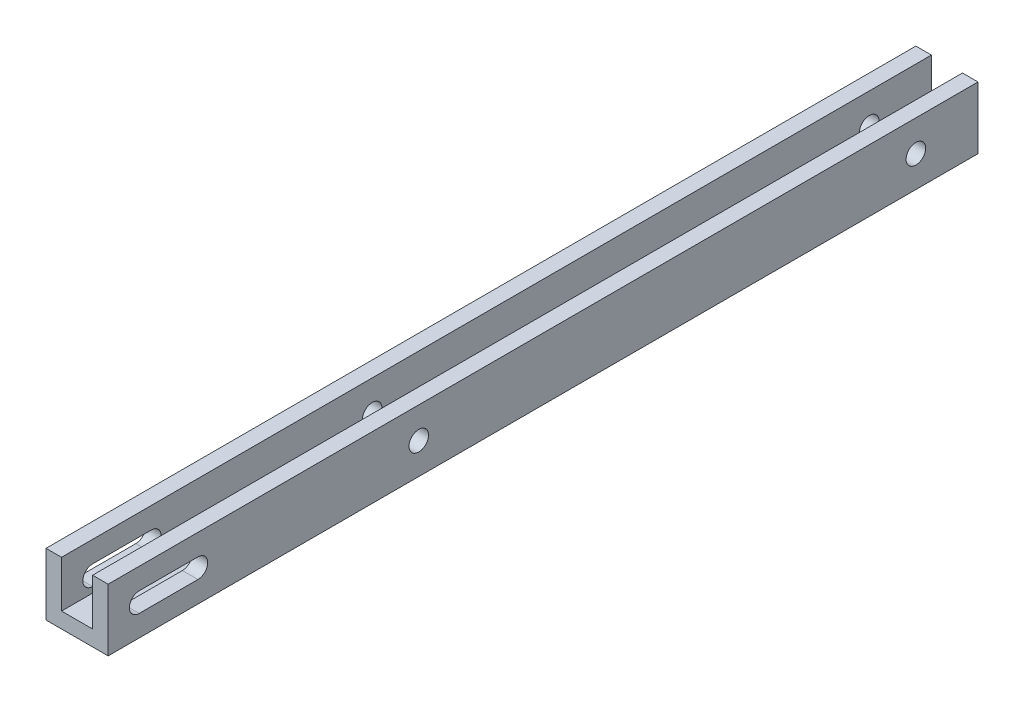
ISO-10303-21;
HEADER;
FILE_DESCRIPTION(('STEP AP214'),'2;1');
FILE_NAME('part.step','',(''),(''),'','','');
FILE_SCHEMA(('AUTOMOTIVE_DESIGN { 1 0 10303 214 1 1 1 1 }'));
ENDSEC;
DATA;
#1=APPLICATION_CONTEXT('core data for automotive mechanical design processes');
#2=APPLICATION_PROTOCOL_DEFINITION('international standard','automotive_design',2000,#1);
#3=PRODUCT_CONTEXT('',#1,'mechanical');
#4=PRODUCT('Part','Part','',(#3));
#5=PRODUCT_RELATED_PRODUCT_CATEGORY('part','',(#4));
#6=PRODUCT_DEFINITION_FORMATION('','',#4);
#7=PRODUCT_DEFINITION_CONTEXT('part definition',#1,'design');
#8=PRODUCT_DEFINITION('design','',#6,#7);
#9=PRODUCT_DEFINITION_SHAPE('','',#8);
#10=(LENGTH_UNIT() NAMED_UNIT(*) SI_UNIT(.MILLI.,.METRE.));
#11=(NAMED_UNIT(*) PLANE_ANGLE_UNIT() SI_UNIT($,.RADIAN.));
#12=(NAMED_UNIT(*) SI_UNIT($,.STERADIAN.) SOLID_ANGLE_UNIT());
#13=UNCERTAINTY_MEASURE_WITH_UNIT(LENGTH_MEASURE(1.E-05),#10,'distance_accuracy_value','');
#14=(GEOMETRIC_REPRESENTATION_CONTEXT(3) GLOBAL_UNCERTAINTY_ASSIGNED_CONTEXT((#13)) GLOBAL_UNIT_ASSIGNED_CONTEXT((#10,
#11,#12)) REPRESENTATION_CONTEXT('',''));
#15=CARTESIAN_POINT('',(0.,0.,0.));
#16=DIRECTION('',(0.,0.,1.));
#17=DIRECTION('',(1.,0.,0.));
#18=AXIS2_PLACEMENT_3D('',#15,#16,#17);
#19=CARTESIAN_POINT('',(-6.35,6.35,88.9));
#20=DIRECTION('',(0.,-1.,0.));
#21=DIRECTION('',(0.,0.,-1.));
#22=AXIS2_PLACEMENT_3D('',#19,#20,#21);
#23=PLANE('',#22);
#24=DIRECTION('',(-1.,0.,0.));
#25=VECTOR('',#24,1.);
#26=CARTESIAN_POINT('',(-6.35,6.35,-88.9));
#27=LINE('',#26,#25);
#28=CARTESIAN_POINT('',(-3.175,6.35,-88.9));
#29=VERTEX_POINT('',#28);
#30=CARTESIAN_POINT('',(-6.35,6.35,-88.9));
#31=VERTEX_POINT('',#30);
#32=EDGE_CURVE('E219',#29,#31,#27,.T.);
#33=ORIENTED_EDGE('',*,*,#32,.T.);
#34=DIRECTION('',(0.,0.,-1.));
#35=VECTOR('',#34,1.);
#36=CARTESIAN_POINT('',(-6.35,6.35,88.9));
#37=LINE('',#36,#35);
#38=CARTESIAN_POINT('',(-6.35,6.35,88.9));
#39=VERTEX_POINT('',#38);
#40=EDGE_CURVE('E270',#39,#31,#37,.T.);
#41=ORIENTED_EDGE('',*,*,#40,.F.);
#42=DIRECTION('',(-1.,0.,0.));
#43=VECTOR('',#42,1.);
#44=CARTESIAN_POINT('',(-6.35,6.35,88.9));
#45=LINE('',#44,#43);
#46=CARTESIAN_POINT('',(-3.175,6.35,88.9));
#47=VERTEX_POINT('',#46);
#48=EDGE_CURVE('E192',#47,#39,#45,.T.);
#49=ORIENTED_EDGE('',*,*,#48,.F.);
#50=DIRECTION('',(0.,0.,-1.));
#51=VECTOR('',#50,1.);
#52=CARTESIAN_POINT('',(-3.175,6.35,88.9));
#53=LINE('',#52,#51);
#54=EDGE_CURVE('E218',#47,#29,#53,.T.);
#55=ORIENTED_EDGE('',*,*,#54,.T.);
#56=EDGE_LOOP('',(#33,#41,#49,#55));
#57=FACE_BOUND('',#56,.T.);
#58=ADVANCED_FACE('F39',(#57),#23,.F.);
#59=CARTESIAN_POINT('',(-6.35,6.35,88.9));
#60=DIRECTION('',(1.,0.,0.));
#61=DIRECTION('',(0.,1.,0.));
#62=AXIS2_PLACEMENT_3D('',#59,#60,#61);
#63=PLANE('',#62);
#64=DIRECTION('',(0.,0.,1.));
#65=VECTOR('',#64,1.);
#66=CARTESIAN_POINT('',(-6.35,2.,82.55));
#67=LINE('',#66,#65);
#68=CARTESIAN_POINT('',(-6.35,2.,70.55));
#69=VERTEX_POINT('',#68);
#70=CARTESIAN_POINT('',(-6.35,2.,82.55));
#71=VERTEX_POINT('',#70);
#72=EDGE_CURVE('E317',#69,#71,#67,.T.);
#73=ORIENTED_EDGE('',*,*,#72,.T.);
#74=CARTESIAN_POINT('',(-6.35,0.,82.55));
#75=DIRECTION('',(1.,0.,0.));
#76=DIRECTION('',(0.,1.,0.));
#77=AXIS2_PLACEMENT_3D('',#74,#75,#76);
#78=CIRCLE('',#77,2.);
#79=CARTESIAN_POINT('',(-6.35,-2.,82.55));
#80=VERTEX_POINT('',#79);
#81=EDGE_CURVE('E571',#71,#80,#78,.T.);
#82=ORIENTED_EDGE('',*,*,#81,.T.);
#83=DIRECTION('',(0.,0.,-1.));
#84=VECTOR('',#83,1.);
#85=CARTESIAN_POINT('',(-6.35,-2.,82.55));
#86=LINE('',#85,#84);
#87=CARTESIAN_POINT('',(-6.35,-2.,70.55));
#88=VERTEX_POINT('',#87);
#89=EDGE_CURVE('E575',#80,#88,#86,.T.);
#90=ORIENTED_EDGE('',*,*,#89,.T.);
#91=CARTESIAN_POINT('',(-6.35,0.,70.55));
#92=DIRECTION('',(1.,0.,0.));
#93=DIRECTION('',(0.,1.,0.));
#94=AXIS2_PLACEMENT_3D('',#91,#92,#93);
#95=CIRCLE('',#94,2.);
#96=EDGE_CURVE('E57',#88,#69,#95,.T.);
#97=ORIENTED_EDGE('',*,*,#96,.T.);
#98=EDGE_LOOP('',(#73,#82,#90,#97));
#99=FACE_BOUND('',#98,.T.);
#100=CARTESIAN_POINT('',(-6.35,0.,-76.2));
#101=DIRECTION('',(1.,0.,0.));
#102=DIRECTION('',(0.,1.,0.));
#103=AXIS2_PLACEMENT_3D('',#100,#101,#102);
#104=CIRCLE('',#103,2.);
#105=CARTESIAN_POINT('',(-6.35,1.99999999999999,-76.2));
#106=VERTEX_POINT('',#105);
#107=EDGE_CURVE('E323',#106,#106,#104,.T.);
#108=ORIENTED_EDGE('',*,*,#107,.T.);
#109=EDGE_LOOP('',(#108));
#110=FACE_BOUND('',#109,.T.);
#111=CARTESIAN_POINT('',(-6.35,0.,25.4));
#112=DIRECTION('',(1.,0.,0.));
#113=DIRECTION('',(0.,1.,0.));
#114=AXIS2_PLACEMENT_3D('',#111,#112,#113);
#115=CIRCLE('',#114,2.);
#116=CARTESIAN_POINT('',(-6.35,2.,25.4));
#117=VERTEX_POINT('',#116);
#118=EDGE_CURVE('E280',#117,#117,#115,.T.);
#119=ORIENTED_EDGE('',*,*,#118,.T.);
#120=EDGE_LOOP('',(#119));
#121=FACE_BOUND('',#120,.T.);
#122=DIRECTION('',(0.,-1.,0.));
#123=VECTOR('',#122,1.);
#124=CARTESIAN_POINT('',(-6.35,6.35,-88.9));
#125=LINE('',#124,#123);
#126=CARTESIAN_POINT('',(-6.35,-6.35,-88.9));
#127=VERTEX_POINT('',#126);
#128=EDGE_CURVE('E223',#31,#127,#125,.T.);
#129=ORIENTED_EDGE('',*,*,#128,.T.);
#130=DIRECTION('',(0.,0.,-1.));
#131=VECTOR('',#130,1.);
#132=CARTESIAN_POINT('',(-6.35,-6.35,88.9));
#133=LINE('',#132,#131);
#134=CARTESIAN_POINT('',(-6.35,-6.35,88.9));
#135=VERTEX_POINT('',#134);
#136=EDGE_CURVE('E266',#135,#127,#133,.T.);
#137=ORIENTED_EDGE('',*,*,#136,.F.);
#138=DIRECTION('',(0.,-1.,0.));
#139=VECTOR('',#138,1.);
#140=CARTESIAN_POINT('',(-6.35,6.35,88.9));
#141=LINE('',#140,#139);
#142=EDGE_CURVE('E196',#39,#135,#141,.T.);
#143=ORIENTED_EDGE('',*,*,#142,.F.);
#144=ORIENTED_EDGE('',*,*,#40,.T.);
#145=EDGE_LOOP('',(#129,#137,#143,#144));
#146=FACE_BOUND('',#145,.T.);
#147=ADVANCED_FACE('F384',(#99,#110,#121,#146),#63,.F.);
#148=CARTESIAN_POINT('',(-6.35,-6.35,88.9));
#149=DIRECTION('',(0.,1.,0.));
#150=DIRECTION('',(-1.,0.,0.));
#151=AXIS2_PLACEMENT_3D('',#148,#149,#150);
#152=PLANE('',#151);
#153=DIRECTION('',(1.,0.,0.));
#154=VECTOR('',#153,1.);
#155=CARTESIAN_POINT('',(-6.35,-6.35,-88.9));
#156=LINE('',#155,#154);
#157=CARTESIAN_POINT('',(6.35,-6.35,-88.9));
#158=VERTEX_POINT('',#157);
#159=EDGE_CURVE('E226',#127,#158,#156,.T.);
#160=ORIENTED_EDGE('',*,*,#159,.T.);
#161=DIRECTION('',(0.,0.,-1.));
#162=VECTOR('',#161,1.);
#163=CARTESIAN_POINT('',(6.35,-6.35,88.9));
#164=LINE('',#163,#162);
#165=CARTESIAN_POINT('',(6.35,-6.35,88.9));
#166=VERTEX_POINT('',#165);
#167=EDGE_CURVE('E262',#166,#158,#164,.T.);
#168=ORIENTED_EDGE('',*,*,#167,.F.);
#169=DIRECTION('',(1.,0.,0.));
#170=VECTOR('',#169,1.);
#171=CARTESIAN_POINT('',(-6.35,-6.35,88.9));
#172=LINE('',#171,#170);
#173=EDGE_CURVE('E200',#135,#166,#172,.T.);
#174=ORIENTED_EDGE('',*,*,#173,.F.);
#175=ORIENTED_EDGE('',*,*,#136,.T.);
#176=EDGE_LOOP('',(#160,#168,#174,#175));
#177=FACE_BOUND('',#176,.T.);
#178=ADVANCED_FACE('F349',(#177),#152,.F.);
#179=CARTESIAN_POINT('',(6.35,-6.35,88.9));
#180=DIRECTION('',(-1.,0.,0.));
#181=DIRECTION('',(0.,-1.,0.));
#182=AXIS2_PLACEMENT_3D('',#179,#180,#181);
#183=PLANE('',#182);
#184=DIRECTION('',(0.,0.,1.));
#185=VECTOR('',#184,1.);
#186=CARTESIAN_POINT('',(6.35,-2.,82.55));
#187=LINE('',#186,#185);
#188=CARTESIAN_POINT('',(6.35,-2.,82.55));
#189=VERTEX_POINT('',#188);
#190=CARTESIAN_POINT('',(6.34999999999999,-2.,70.55));
#191=VERTEX_POINT('',#190);
#192=EDGE_CURVE('E158',#189,#191,#187,.F.);
#193=ORIENTED_EDGE('',*,*,#192,.F.);
#194=CARTESIAN_POINT('',(6.34999999999999,0.,82.55));
#195=DIRECTION('',(1.,0.,0.));
#196=DIRECTION('',(0.,1.,0.));
#197=AXIS2_PLACEMENT_3D('',#194,#195,#196);
#198=CIRCLE('',#197,2.);
#199=CARTESIAN_POINT('',(6.34999999999999,2.,82.55));
#200=VERTEX_POINT('',#199);
#201=EDGE_CURVE('E42',#200,#189,#198,.T.);
#202=ORIENTED_EDGE('',*,*,#201,.F.);
#203=DIRECTION('',(0.,0.,1.));
#204=VECTOR('',#203,1.);
#205=CARTESIAN_POINT('',(6.35,2.,82.55));
#206=LINE('',#205,#204);
#207=CARTESIAN_POINT('',(6.34999999999999,2.,70.55));
#208=VERTEX_POINT('',#207);
#209=EDGE_CURVE('E81',#208,#200,#206,.T.);
#210=ORIENTED_EDGE('',*,*,#209,.F.);
#211=CARTESIAN_POINT('',(6.34999999999999,0.,70.55));
#212=DIRECTION('',(1.,0.,0.));
#213=DIRECTION('',(0.,1.,0.));
#214=AXIS2_PLACEMENT_3D('',#211,#212,#213);
#215=CIRCLE('',#214,2.);
#216=EDGE_CURVE('E172',#191,#208,#215,.T.);
#217=ORIENTED_EDGE('',*,*,#216,.F.);
#218=EDGE_LOOP('',(#193,#202,#210,#217));
#219=FACE_BOUND('',#218,.T.);
#220=CARTESIAN_POINT('',(6.35,0.,-76.2));
#221=DIRECTION('',(-1.,0.,0.));
#222=DIRECTION('',(0.,-1.,0.));
#223=AXIS2_PLACEMENT_3D('',#220,#221,#222);
#224=CIRCLE('',#223,2.);
#225=CARTESIAN_POINT('',(6.35,2.,-76.2));
#226=VERTEX_POINT('',#225);
#227=EDGE_CURVE('E177',#226,#226,#224,.T.);
#228=ORIENTED_EDGE('',*,*,#227,.T.);
#229=EDGE_LOOP('',(#228));
#230=FACE_BOUND('',#229,.T.);
#231=CARTESIAN_POINT('',(6.35,0.,25.4));
#232=DIRECTION('',(-1.,0.,0.));
#233=DIRECTION('',(0.,-1.,0.));
#234=AXIS2_PLACEMENT_3D('',#231,#232,#233);
#235=CIRCLE('',#234,2.);
#236=CARTESIAN_POINT('',(6.35,2.,25.4));
#237=VERTEX_POINT('',#236);
#238=EDGE_CURVE('E285',#237,#237,#235,.T.);
#239=ORIENTED_EDGE('',*,*,#238,.T.);
#240=EDGE_LOOP('',(#239));
#241=FACE_BOUND('',#240,.T.);
#242=DIRECTION('',(0.,1.,0.));
#243=VECTOR('',#242,1.);
#244=CARTESIAN_POINT('',(6.35,-6.35,-88.9));
#245=LINE('',#244,#243);
#246=CARTESIAN_POINT('',(6.34999999999999,6.35,-88.9));
#247=VERTEX_POINT('',#246);
#248=EDGE_CURVE('E229',#158,#247,#245,.T.);
#249=ORIENTED_EDGE('',*,*,#248,.T.);
#250=DIRECTION('',(0.,0.,-1.));
#251=VECTOR('',#250,1.);
#252=CARTESIAN_POINT('',(6.34999999999999,6.35,88.9));
#253=LINE('',#252,#251);
#254=CARTESIAN_POINT('',(6.34999999999999,6.35,88.9));
#255=VERTEX_POINT('',#254);
#256=EDGE_CURVE('E258',#255,#247,#253,.T.);
#257=ORIENTED_EDGE('',*,*,#256,.F.);
#258=DIRECTION('',(0.,1.,0.));
#259=VECTOR('',#258,1.);
#260=CARTESIAN_POINT('',(6.35,-6.35,88.9));
#261=LINE('',#260,#259);
#262=EDGE_CURVE('E203',#166,#255,#261,.T.);
#263=ORIENTED_EDGE('',*,*,#262,.F.);
#264=ORIENTED_EDGE('',*,*,#167,.T.);
#265=EDGE_LOOP('',(#249,#257,#263,#264));
#266=FACE_BOUND('',#265,.T.);
#267=ADVANCED_FACE('F305',(#219,#230,#241,#266),#183,.F.);
#268=CARTESIAN_POINT('',(3.175,6.35,88.9));
#269=DIRECTION('',(0.,-1.,0.));
#270=DIRECTION('',(1.,0.,0.));
#271=AXIS2_PLACEMENT_3D('',#268,#269,#270);
#272=PLANE('',#271);
#273=DIRECTION('',(-1.,0.,0.));
#274=VECTOR('',#273,1.);
#275=CARTESIAN_POINT('',(3.175,6.35,-88.9));
#276=LINE('',#275,#274);
#277=CARTESIAN_POINT('',(3.175,6.35,-88.9));
#278=VERTEX_POINT('',#277);
#279=EDGE_CURVE('E232',#247,#278,#276,.T.);
#280=ORIENTED_EDGE('',*,*,#279,.T.);
#281=DIRECTION('',(0.,0.,-1.));
#282=VECTOR('',#281,1.);
#283=CARTESIAN_POINT('',(3.175,6.35,88.9));
#284=LINE('',#283,#282);
#285=CARTESIAN_POINT('',(3.175,6.35,88.9));
#286=VERTEX_POINT('',#285);
#287=EDGE_CURVE('E254',#286,#278,#284,.T.);
#288=ORIENTED_EDGE('',*,*,#287,.F.);
#289=DIRECTION('',(-1.,0.,0.));
#290=VECTOR('',#289,1.);
#291=CARTESIAN_POINT('',(3.175,6.35,88.9));
#292=LINE('',#291,#290);
#293=EDGE_CURVE('E206',#255,#286,#292,.T.);
#294=ORIENTED_EDGE('',*,*,#293,.F.);
#295=ORIENTED_EDGE('',*,*,#256,.T.);
#296=EDGE_LOOP('',(#280,#288,#294,#295));
#297=FACE_BOUND('',#296,.T.);
#298=ADVANCED_FACE('F348',(#297),#272,.F.);
#299=CARTESIAN_POINT('',(3.175,-3.175,88.9));
#300=DIRECTION('',(1.,0.,0.));
#301=DIRECTION('',(0.,1.,0.));
#302=AXIS2_PLACEMENT_3D('',#299,#300,#301);
#303=PLANE('',#302);
#304=DIRECTION('',(0.,0.,1.));
#305=VECTOR('',#304,1.);
#306=CARTESIAN_POINT('',(3.175,2.,88.9));
#307=LINE('',#306,#305);
#308=CARTESIAN_POINT('',(3.17499999999999,2.,70.55));
#309=VERTEX_POINT('',#308);
#310=CARTESIAN_POINT('',(3.175,2.,82.55));
#311=VERTEX_POINT('',#310);
#312=EDGE_CURVE('E187',#309,#311,#307,.T.);
#313=ORIENTED_EDGE('',*,*,#312,.T.);
#314=CARTESIAN_POINT('',(3.175,0.,82.55));
#315=DIRECTION('',(1.,0.,0.));
#316=DIRECTION('',(0.,1.,0.));
#317=AXIS2_PLACEMENT_3D('',#314,#315,#316);
#318=CIRCLE('',#317,2.);
#319=CARTESIAN_POINT('',(3.175,-2.,82.55));
#320=VERTEX_POINT('',#319);
#321=EDGE_CURVE('E91',#311,#320,#318,.T.);
#322=ORIENTED_EDGE('',*,*,#321,.T.);
#323=DIRECTION('',(0.,0.,-1.));
#324=VECTOR('',#323,1.);
#325=CARTESIAN_POINT('',(3.175,-2.,88.9));
#326=LINE('',#325,#324);
#327=CARTESIAN_POINT('',(3.175,-2.,70.55));
#328=VERTEX_POINT('',#327);
#329=EDGE_CURVE('E156',#320,#328,#326,.T.);
#330=ORIENTED_EDGE('',*,*,#329,.T.);
#331=CARTESIAN_POINT('',(3.175,0.,70.55));
#332=DIRECTION('',(1.,0.,0.));
#333=DIRECTION('',(0.,1.,0.));
#334=AXIS2_PLACEMENT_3D('',#331,#332,#333);
#335=CIRCLE('',#334,2.);
#336=EDGE_CURVE('E166',#328,#309,#335,.T.);
#337=ORIENTED_EDGE('',*,*,#336,.T.);
#338=EDGE_LOOP('',(#313,#322,#330,#337));
#339=FACE_BOUND('',#338,.T.);
#340=CARTESIAN_POINT('',(3.175,0.,-76.2));
#341=DIRECTION('',(1.,0.,0.));
#342=DIRECTION('',(0.,1.,0.));
#343=AXIS2_PLACEMENT_3D('',#340,#341,#342);
#344=CIRCLE('',#343,2.);
#345=CARTESIAN_POINT('',(3.175,2.,-76.2));
#346=VERTEX_POINT('',#345);
#347=EDGE_CURVE('E183',#346,#346,#344,.T.);
#348=ORIENTED_EDGE('',*,*,#347,.T.);
#349=EDGE_LOOP('',(#348));
#350=FACE_BOUND('',#349,.T.);
#351=CARTESIAN_POINT('',(3.175,0.,25.4));
#352=DIRECTION('',(1.,0.,0.));
#353=DIRECTION('',(0.,1.,0.));
#354=AXIS2_PLACEMENT_3D('',#351,#352,#353);
#355=CIRCLE('',#354,2.);
#356=CARTESIAN_POINT('',(3.175,2.,25.4));
#357=VERTEX_POINT('',#356);
#358=EDGE_CURVE('E279',#357,#357,#355,.T.);
#359=ORIENTED_EDGE('',*,*,#358,.T.);
#360=EDGE_LOOP('',(#359));
#361=FACE_BOUND('',#360,.T.);
#362=DIRECTION('',(0.,-1.,0.));
#363=VECTOR('',#362,1.);
#364=CARTESIAN_POINT('',(3.175,-3.175,-88.9));
#365=LINE('',#364,#363);
#366=CARTESIAN_POINT('',(3.175,-3.175,-88.9));
#367=VERTEX_POINT('',#366);
#368=EDGE_CURVE('E235',#278,#367,#365,.T.);
#369=ORIENTED_EDGE('',*,*,#368,.T.);
#370=DIRECTION('',(0.,0.,-1.));
#371=VECTOR('',#370,1.);
#372=CARTESIAN_POINT('',(3.175,-3.175,88.9));
#373=LINE('',#372,#371);
#374=CARTESIAN_POINT('',(3.175,-3.175,88.9));
#375=VERTEX_POINT('',#374);
#376=EDGE_CURVE('E250',#375,#367,#373,.T.);
#377=ORIENTED_EDGE('',*,*,#376,.F.);
#378=DIRECTION('',(0.,-1.,0.));
#379=VECTOR('',#378,1.);
#380=CARTESIAN_POINT('',(3.175,-3.175,88.9));
#381=LINE('',#380,#379);
#382=EDGE_CURVE('E209',#286,#375,#381,.T.);
#383=ORIENTED_EDGE('',*,*,#382,.F.);
#384=ORIENTED_EDGE('',*,*,#287,.T.);
#385=EDGE_LOOP('',(#369,#377,#383,#384));
#386=FACE_BOUND('',#385,.T.);
#387=ADVANCED_FACE('F174',(#339,#350,#361,#386),#303,.F.);
#388=CARTESIAN_POINT('',(-3.175,-3.175,88.9));
#389=DIRECTION('',(0.,-1.,0.));
#390=DIRECTION('',(1.,0.,0.));
#391=AXIS2_PLACEMENT_3D('',#388,#389,#390);
#392=PLANE('',#391);
#393=DIRECTION('',(-1.,0.,0.));
#394=VECTOR('',#393,1.);
#395=CARTESIAN_POINT('',(-3.175,-3.175,-88.9));
#396=LINE('',#395,#394);
#397=CARTESIAN_POINT('',(-3.175,-3.175,-88.9));
#398=VERTEX_POINT('',#397);
#399=EDGE_CURVE('E238',#367,#398,#396,.T.);
#400=ORIENTED_EDGE('',*,*,#399,.T.);
#401=DIRECTION('',(0.,0.,-1.));
#402=VECTOR('',#401,1.);
#403=CARTESIAN_POINT('',(-3.175,-3.175,88.9));
#404=LINE('',#403,#402);
#405=CARTESIAN_POINT('',(-3.175,-3.175,88.9));
#406=VERTEX_POINT('',#405);
#407=EDGE_CURVE('E246',#406,#398,#404,.T.);
#408=ORIENTED_EDGE('',*,*,#407,.F.);
#409=DIRECTION('',(-1.,0.,0.));
#410=VECTOR('',#409,1.);
#411=CARTESIAN_POINT('',(-3.175,-3.175,88.9));
#412=LINE('',#411,#410);
#413=EDGE_CURVE('E212',#375,#406,#412,.T.);
#414=ORIENTED_EDGE('',*,*,#413,.F.);
#415=ORIENTED_EDGE('',*,*,#376,.T.);
#416=EDGE_LOOP('',(#400,#408,#414,#415));
#417=FACE_BOUND('',#416,.T.);
#418=ADVANCED_FACE('F373',(#417),#392,.F.);
#419=CARTESIAN_POINT('',(-3.175,6.35,88.9));
#420=DIRECTION('',(-1.,0.,0.));
#421=DIRECTION('',(0.,0.,1.));
#422=AXIS2_PLACEMENT_3D('',#419,#420,#421);
#423=PLANE('',#422);
#424=DIRECTION('',(0.,0.,1.));
#425=VECTOR('',#424,1.);
#426=CARTESIAN_POINT('',(-3.175,-2.,88.9));
#427=LINE('',#426,#425);
#428=CARTESIAN_POINT('',(-3.175,-2.,70.55));
#429=VERTEX_POINT('',#428);
#430=CARTESIAN_POINT('',(-3.175,-2.,82.55));
#431=VERTEX_POINT('',#430);
#432=EDGE_CURVE('E274',#429,#431,#427,.T.);
#433=ORIENTED_EDGE('',*,*,#432,.T.);
#434=CARTESIAN_POINT('',(-3.175,0.,82.55));
#435=DIRECTION('',(-1.,0.,0.));
#436=DIRECTION('',(0.,0.,1.));
#437=AXIS2_PLACEMENT_3D('',#434,#435,#436);
#438=CIRCLE('',#437,2.);
#439=CARTESIAN_POINT('',(-3.175,2.,82.55));
#440=VERTEX_POINT('',#439);
#441=EDGE_CURVE('E11',#431,#440,#438,.T.);
#442=ORIENTED_EDGE('',*,*,#441,.T.);
#443=DIRECTION('',(0.,0.,-1.));
#444=VECTOR('',#443,1.);
#445=CARTESIAN_POINT('',(-3.175,2.,88.9));
#446=LINE('',#445,#444);
#447=CARTESIAN_POINT('',(-3.175,2.,70.55));
#448=VERTEX_POINT('',#447);
#449=EDGE_CURVE('E49',#440,#448,#446,.T.);
#450=ORIENTED_EDGE('',*,*,#449,.T.);
#451=CARTESIAN_POINT('',(-3.175,0.,70.55));
#452=DIRECTION('',(-1.,0.,0.));
#453=DIRECTION('',(0.,0.,1.));
#454=AXIS2_PLACEMENT_3D('',#451,#452,#453);
#455=CIRCLE('',#454,2.);
#456=EDGE_CURVE('E289',#448,#429,#455,.T.);
#457=ORIENTED_EDGE('',*,*,#456,.T.);
#458=EDGE_LOOP('',(#433,#442,#450,#457));
#459=FACE_BOUND('',#458,.T.);
#460=CARTESIAN_POINT('',(-3.175,0.,-76.2));
#461=DIRECTION('',(-1.,0.,0.));
#462=DIRECTION('',(0.,0.,1.));
#463=AXIS2_PLACEMENT_3D('',#460,#461,#462);
#464=CIRCLE('',#463,2.);
#465=CARTESIAN_POINT('',(-3.175,2.,-76.2));
#466=VERTEX_POINT('',#465);
#467=EDGE_CURVE('E281',#466,#466,#464,.T.);
#468=ORIENTED_EDGE('',*,*,#467,.T.);
#469=EDGE_LOOP('',(#468));
#470=FACE_BOUND('',#469,.T.);
#471=CARTESIAN_POINT('',(-3.175,0.,25.4));
#472=DIRECTION('',(-1.,0.,0.));
#473=DIRECTION('',(0.,0.,1.));
#474=AXIS2_PLACEMENT_3D('',#471,#472,#473);
#475=CIRCLE('',#474,2.);
#476=CARTESIAN_POINT('',(-3.175,2.,25.4));
#477=VERTEX_POINT('',#476);
#478=EDGE_CURVE('E275',#477,#477,#475,.T.);
#479=ORIENTED_EDGE('',*,*,#478,.T.);
#480=EDGE_LOOP('',(#479));
#481=FACE_BOUND('',#480,.T.);
#482=DIRECTION('',(0.,1.,0.));
#483=VECTOR('',#482,1.);
#484=CARTESIAN_POINT('',(-3.175,6.35,-88.9));
#485=LINE('',#484,#483);
#486=EDGE_CURVE('E197',#398,#29,#485,.T.);
#487=ORIENTED_EDGE('',*,*,#486,.T.);
#488=ORIENTED_EDGE('',*,*,#54,.F.);
#489=DIRECTION('',(0.,1.,0.));
#490=VECTOR('',#489,1.);
#491=CARTESIAN_POINT('',(-3.175,6.35,88.9));
#492=LINE('',#491,#490);
#493=EDGE_CURVE('E215',#406,#47,#492,.T.);
#494=ORIENTED_EDGE('',*,*,#493,.F.);
#495=ORIENTED_EDGE('',*,*,#407,.T.);
#496=EDGE_LOOP('',(#487,#488,#494,#495));
#497=FACE_BOUND('',#496,.T.);
#498=ADVANCED_FACE('F388',(#459,#470,#481,#497),#423,.F.);
#499=CARTESIAN_POINT('',(-3.175,6.35,88.9));
#500=DIRECTION('',(0.,0.,-1.));
#501=DIRECTION('',(-1.,0.,0.));
#502=AXIS2_PLACEMENT_3D('',#499,#500,#501);
#503=PLANE('',#502);
#504=ORIENTED_EDGE('',*,*,#48,.T.);
#505=ORIENTED_EDGE('',*,*,#142,.T.);
#506=ORIENTED_EDGE('',*,*,#173,.T.);
#507=ORIENTED_EDGE('',*,*,#262,.T.);
#508=ORIENTED_EDGE('',*,*,#293,.T.);
#509=ORIENTED_EDGE('',*,*,#382,.T.);
#510=ORIENTED_EDGE('',*,*,#413,.T.);
#511=ORIENTED_EDGE('',*,*,#493,.T.);
#512=EDGE_LOOP('',(#504,#505,#506,#507,#508,#509,#510,#511));
#513=FACE_BOUND('',#512,.T.);
#514=ADVANCED_FACE('F377',(#513),#503,.F.);
#515=CARTESIAN_POINT('',(-3.175,6.35,-88.9));
#516=DIRECTION('',(0.,0.,-1.));
#517=DIRECTION('',(-1.,0.,0.));
#518=AXIS2_PLACEMENT_3D('',#515,#516,#517);
#519=PLANE('',#518);
#520=ORIENTED_EDGE('',*,*,#32,.F.);
#521=ORIENTED_EDGE('',*,*,#486,.F.);
#522=ORIENTED_EDGE('',*,*,#399,.F.);
#523=ORIENTED_EDGE('',*,*,#368,.F.);
#524=ORIENTED_EDGE('',*,*,#279,.F.);
#525=ORIENTED_EDGE('',*,*,#248,.F.);
#526=ORIENTED_EDGE('',*,*,#159,.F.);
#527=ORIENTED_EDGE('',*,*,#128,.F.);
#528=EDGE_LOOP('',(#520,#521,#522,#523,#524,#525,#526,#527));
#529=FACE_BOUND('',#528,.T.);
#530=ADVANCED_FACE('F365',(#529),#519,.T.);
#531=CARTESIAN_POINT('',(-6.35,0.,25.4));
#532=DIRECTION('',(1.,0.,0.));
#533=DIRECTION('',(0.,1.,0.));
#534=AXIS2_PLACEMENT_3D('',#531,#532,#533);
#535=CYLINDRICAL_SURFACE('',#534,2.);
#536=CARTESIAN_POINT('',(-6.35,2.,25.4));
#537=CARTESIAN_POINT('',(-6.31692708333333,2.,25.4));
#538=CARTESIAN_POINT('',(-6.28385416666667,2.,25.4));
#539=CARTESIAN_POINT('',(-6.21770833333333,2.,25.4));
#540=CARTESIAN_POINT('',(-6.18463541666666,2.,25.4));
#541=CARTESIAN_POINT('',(-6.11848958333333,2.,25.4));
#542=CARTESIAN_POINT('',(-6.08541666666667,2.,25.4));
#543=CARTESIAN_POINT('',(-6.01927083333333,2.,25.4));
#544=CARTESIAN_POINT('',(-5.98619791666667,2.,25.4));
#545=CARTESIAN_POINT('',(-5.92005208333333,2.,25.4));
#546=CARTESIAN_POINT('',(-5.88697916666667,2.,25.4));
#547=CARTESIAN_POINT('',(-5.82083333333333,2.,25.4));
#548=CARTESIAN_POINT('',(-5.78776041666667,2.,25.4));
#549=CARTESIAN_POINT('',(-5.72161458333333,2.,25.4));
#550=CARTESIAN_POINT('',(-5.68854166666667,2.,25.4));
#551=CARTESIAN_POINT('',(-5.62239583333333,2.,25.4));
#552=CARTESIAN_POINT('',(-5.58932291666667,2.,25.4));
#553=CARTESIAN_POINT('',(-5.52317708333333,2.,25.4));
#554=CARTESIAN_POINT('',(-5.49010416666667,2.,25.4));
#555=CARTESIAN_POINT('',(-5.42395833333333,2.,25.4));
#556=CARTESIAN_POINT('',(-5.39088541666667,2.,25.4));
#557=CARTESIAN_POINT('',(-5.32473958333333,2.,25.4));
#558=CARTESIAN_POINT('',(-5.29166666666667,2.,25.4));
#559=CARTESIAN_POINT('',(-5.22552083333333,2.,25.4));
#560=CARTESIAN_POINT('',(-5.19244791666667,2.,25.4));
#561=CARTESIAN_POINT('',(-5.12630208333333,2.,25.4));
#562=CARTESIAN_POINT('',(-5.09322916666667,2.,25.4));
#563=CARTESIAN_POINT('',(-5.02708333333333,2.,25.4));
#564=CARTESIAN_POINT('',(-4.99401041666667,2.,25.4));
#565=CARTESIAN_POINT('',(-4.92786458333333,2.,25.4));
#566=CARTESIAN_POINT('',(-4.89479166666667,2.,25.4));
#567=CARTESIAN_POINT('',(-4.82864583333333,2.,25.4));
#568=CARTESIAN_POINT('',(-4.79557291666667,2.,25.4));
#569=CARTESIAN_POINT('',(-4.72942708333333,2.,25.4));
#570=CARTESIAN_POINT('',(-4.69635416666667,2.,25.4));
#571=CARTESIAN_POINT('',(-4.63020833333333,2.,25.4));
#572=CARTESIAN_POINT('',(-4.59713541666667,2.,25.4));
#573=CARTESIAN_POINT('',(-4.53098958333333,2.,25.4));
#574=CARTESIAN_POINT('',(-4.49791666666667,2.,25.4));
#575=CARTESIAN_POINT('',(-4.43177083333333,2.,25.4));
#576=CARTESIAN_POINT('',(-4.39869791666667,2.,25.4));
#577=CARTESIAN_POINT('',(-4.33255208333333,2.,25.4));
#578=CARTESIAN_POINT('',(-4.29947916666667,2.,25.4));
#579=CARTESIAN_POINT('',(-4.23333333333333,2.,25.4));
#580=CARTESIAN_POINT('',(-4.20026041666667,2.,25.4));
#581=CARTESIAN_POINT('',(-4.13411458333333,2.,25.4));
#582=CARTESIAN_POINT('',(-4.10104166666667,2.,25.4));
#583=CARTESIAN_POINT('',(-4.03489583333333,2.,25.4));
#584=CARTESIAN_POINT('',(-4.00182291666667,2.,25.4));
#585=CARTESIAN_POINT('',(-3.93567708333333,2.,25.4));
#586=CARTESIAN_POINT('',(-3.90260416666667,2.,25.4));
#587=CARTESIAN_POINT('',(-3.83645833333333,2.,25.4));
#588=CARTESIAN_POINT('',(-3.80338541666667,2.,25.4));
#589=CARTESIAN_POINT('',(-3.73723958333333,2.,25.4));
#590=CARTESIAN_POINT('',(-3.70416666666667,2.,25.4));
#591=CARTESIAN_POINT('',(-3.63802083333333,2.,25.4));
#592=CARTESIAN_POINT('',(-3.60494791666667,2.,25.4));
#593=CARTESIAN_POINT('',(-3.53880208333333,2.,25.4));
#594=CARTESIAN_POINT('',(-3.50572916666667,2.,25.4));
#595=CARTESIAN_POINT('',(-3.43958333333333,2.,25.4));
#596=CARTESIAN_POINT('',(-3.40651041666667,2.,25.4));
#597=CARTESIAN_POINT('',(-3.34036458333333,2.,25.4));
#598=CARTESIAN_POINT('',(-3.30729166666667,2.,25.4));
#599=CARTESIAN_POINT('',(-3.24114583333333,2.,25.4));
#600=CARTESIAN_POINT('',(-3.20807291666667,2.,25.4));
#601=CARTESIAN_POINT('',(-3.175,2.,25.4));
#602=B_SPLINE_CURVE_WITH_KNOTS('',3,(#536,#537,#538,#539,#540,#541,#542,#543,#544,#545,#546,
#547,#548,#549,#550,#551,#552,#553,#554,#555,#556,#557,#558,#559,#560,#561,#562,#563,#564,#565,
#566,#567,#568,#569,#570,#571,#572,#573,#574,#575,#576,#577,#578,#579,#580,#581,#582,#583,#584,
#585,#586,#587,#588,#589,#590,#591,#592,#593,#594,#595,#596,#597,#598,#599,#600,#601),
.UNSPECIFIED.,.F.,.F.,(4,2,2,2,2,2,2,2,2,2,2,2,2,2,2,2,2,2,2,2,2,2,2,2,2,2,2,2,2,2,2,2,4),(0.,
0.0992187500000004,0.198437500000001,0.29765625,0.396875000000001,0.49609375,0.5953125,
0.69453125,0.79375,0.89296875,0.9921875,1.09140625,1.190625,1.28984375,1.3890625,1.48828125,
1.5875,1.68671875,1.7859375,1.88515625,1.984375,2.08359375,2.1828125,2.28203125,2.38125,
2.48046875,2.5796875,2.67890625,2.778125,2.87734375,2.9765625,3.07578125,3.175),.UNSPECIFIED.);
#603=EDGE_CURVE('BSEAM442',#117,#477,#602,.T.);
#604=ORIENTED_EDGE('',*,*,#118,.F.);
#605=ORIENTED_EDGE('',*,*,#478,.F.);
#606=ORIENTED_EDGE('',*,*,#603,.T.);
#607=ORIENTED_EDGE('',*,*,#603,.F.);
#608=EDGE_LOOP('',(#604,#606,#605,#607));
#609=FACE_BOUND('',#608,.T.);
#610=ADVANCED_FACE('F442',(#609),#535,.F.);
#611=CARTESIAN_POINT('',(-6.35,0.,-76.2));
#612=DIRECTION('',(1.,0.,0.));
#613=DIRECTION('',(0.,1.,0.));
#614=AXIS2_PLACEMENT_3D('',#611,#612,#613);
#615=CYLINDRICAL_SURFACE('',#614,2.);
#616=CARTESIAN_POINT('',(-6.35,1.99999999999999,-76.2));
#617=CARTESIAN_POINT('',(-6.31692708333333,1.99999999999999,-76.2));
#618=CARTESIAN_POINT('',(-6.28385416666667,1.99999999999999,-76.2));
#619=CARTESIAN_POINT('',(-6.21770833333333,1.99999999999999,-76.2));
#620=CARTESIAN_POINT('',(-6.18463541666666,1.99999999999999,-76.2));
#621=CARTESIAN_POINT('',(-6.11848958333333,1.99999999999999,-76.2));
#622=CARTESIAN_POINT('',(-6.08541666666667,1.99999999999999,-76.2));
#623=CARTESIAN_POINT('',(-6.01927083333333,1.99999999999999,-76.2));
#624=CARTESIAN_POINT('',(-5.98619791666667,1.99999999999999,-76.2));
#625=CARTESIAN_POINT('',(-5.92005208333333,1.99999999999999,-76.2));
#626=CARTESIAN_POINT('',(-5.88697916666667,1.99999999999999,-76.2));
#627=CARTESIAN_POINT('',(-5.82083333333333,1.99999999999999,-76.2));
#628=CARTESIAN_POINT('',(-5.78776041666667,1.99999999999999,-76.2));
#629=CARTESIAN_POINT('',(-5.72161458333333,1.99999999999999,-76.2));
#630=CARTESIAN_POINT('',(-5.68854166666667,1.99999999999999,-76.2));
#631=CARTESIAN_POINT('',(-5.62239583333333,1.99999999999999,-76.2));
#632=CARTESIAN_POINT('',(-5.58932291666667,1.99999999999999,-76.2));
#633=CARTESIAN_POINT('',(-5.52317708333333,1.99999999999999,-76.2));
#634=CARTESIAN_POINT('',(-5.49010416666667,1.99999999999999,-76.2));
#635=CARTESIAN_POINT('',(-5.42395833333333,1.99999999999999,-76.2));
#636=CARTESIAN_POINT('',(-5.39088541666667,1.99999999999999,-76.2));
#637=CARTESIAN_POINT('',(-5.32473958333333,1.99999999999999,-76.2));
#638=CARTESIAN_POINT('',(-5.29166666666667,1.99999999999999,-76.2));
#639=CARTESIAN_POINT('',(-5.22552083333333,1.99999999999999,-76.2));
#640=CARTESIAN_POINT('',(-5.19244791666667,1.99999999999999,-76.2));
#641=CARTESIAN_POINT('',(-5.12630208333333,1.99999999999999,-76.2));
#642=CARTESIAN_POINT('',(-5.09322916666667,1.99999999999999,-76.2));
#643=CARTESIAN_POINT('',(-5.02708333333333,1.99999999999999,-76.2));
#644=CARTESIAN_POINT('',(-4.99401041666667,1.99999999999999,-76.2));
#645=CARTESIAN_POINT('',(-4.92786458333333,1.99999999999999,-76.2));
#646=CARTESIAN_POINT('',(-4.89479166666667,1.99999999999999,-76.2));
#647=CARTESIAN_POINT('',(-4.82864583333333,1.99999999999999,-76.2));
#648=CARTESIAN_POINT('',(-4.79557291666667,1.99999999999999,-76.2));
#649=CARTESIAN_POINT('',(-4.72942708333333,1.99999999999999,-76.2));
#650=CARTESIAN_POINT('',(-4.69635416666667,1.99999999999999,-76.2));
#651=CARTESIAN_POINT('',(-4.63020833333333,1.99999999999999,-76.2));
#652=CARTESIAN_POINT('',(-4.59713541666667,1.99999999999999,-76.2));
#653=CARTESIAN_POINT('',(-4.53098958333333,1.99999999999999,-76.2));
#654=CARTESIAN_POINT('',(-4.49791666666667,1.99999999999999,-76.2));
#655=CARTESIAN_POINT('',(-4.43177083333333,1.99999999999999,-76.2));
#656=CARTESIAN_POINT('',(-4.39869791666667,1.99999999999999,-76.2));
#657=CARTESIAN_POINT('',(-4.33255208333333,1.99999999999999,-76.2));
#658=CARTESIAN_POINT('',(-4.29947916666667,1.99999999999999,-76.2));
#659=CARTESIAN_POINT('',(-4.23333333333333,1.99999999999999,-76.2));
#660=CARTESIAN_POINT('',(-4.20026041666667,1.99999999999999,-76.2));
#661=CARTESIAN_POINT('',(-4.13411458333333,1.99999999999999,-76.2));
#662=CARTESIAN_POINT('',(-4.10104166666667,1.99999999999999,-76.2));
#663=CARTESIAN_POINT('',(-4.03489583333333,1.99999999999999,-76.2));
#664=CARTESIAN_POINT('',(-4.00182291666667,1.99999999999999,-76.2));
#665=CARTESIAN_POINT('',(-3.93567708333333,1.99999999999999,-76.2));
#666=CARTESIAN_POINT('',(-3.90260416666667,2.,-76.2));
#667=CARTESIAN_POINT('',(-3.83645833333333,2.,-76.2));
#668=CARTESIAN_POINT('',(-3.80338541666667,2.,-76.2));
#669=CARTESIAN_POINT('',(-3.73723958333333,2.,-76.2));
#670=CARTESIAN_POINT('',(-3.70416666666667,2.,-76.2));
#671=CARTESIAN_POINT('',(-3.63802083333333,2.,-76.2));
#672=CARTESIAN_POINT('',(-3.60494791666667,2.,-76.2));
#673=CARTESIAN_POINT('',(-3.53880208333333,2.,-76.2));
#674=CARTESIAN_POINT('',(-3.50572916666667,2.,-76.2));
#675=CARTESIAN_POINT('',(-3.43958333333333,2.,-76.2));
#676=CARTESIAN_POINT('',(-3.40651041666667,2.,-76.2));
#677=CARTESIAN_POINT('',(-3.34036458333333,2.,-76.2));
#678=CARTESIAN_POINT('',(-3.30729166666667,2.,-76.2));
#679=CARTESIAN_POINT('',(-3.24114583333333,2.,-76.2));
#680=CARTESIAN_POINT('',(-3.20807291666667,2.,-76.2));
#681=CARTESIAN_POINT('',(-3.175,2.,-76.2));
#682=B_SPLINE_CURVE_WITH_KNOTS('',3,(#616,#617,#618,#619,#620,#621,#622,#623,#624,#625,#626,
#627,#628,#629,#630,#631,#632,#633,#634,#635,#636,#637,#638,#639,#640,#641,#642,#643,#644,#645,
#646,#647,#648,#649,#650,#651,#652,#653,#654,#655,#656,#657,#658,#659,#660,#661,#662,#663,#664,
#665,#666,#667,#668,#669,#670,#671,#672,#673,#674,#675,#676,#677,#678,#679,#680,#681),
.UNSPECIFIED.,.F.,.F.,(4,2,2,2,2,2,2,2,2,2,2,2,2,2,2,2,2,2,2,2,2,2,2,2,2,2,2,2,2,2,2,2,4),(0.,
0.0992187500000004,0.198437500000001,0.29765625,0.396875000000001,0.49609375,0.5953125,
0.69453125,0.79375,0.89296875,0.9921875,1.09140625,1.190625,1.28984375,1.3890625,1.48828125,
1.5875,1.68671875,1.7859375,1.88515625,1.984375,2.08359375,2.1828125,2.28203125,2.38125,
2.48046875,2.5796875,2.67890625,2.778125,2.87734375,2.9765625,3.07578125,3.175),.UNSPECIFIED.);
#683=EDGE_CURVE('BSEAM344',#106,#466,#682,.T.);
#684=ORIENTED_EDGE('',*,*,#107,.F.);
#685=ORIENTED_EDGE('',*,*,#467,.F.);
#686=ORIENTED_EDGE('',*,*,#683,.T.);
#687=ORIENTED_EDGE('',*,*,#683,.F.);
#688=EDGE_LOOP('',(#684,#686,#685,#687));
#689=FACE_BOUND('',#688,.T.);
#690=ADVANCED_FACE('F344',(#689),#615,.F.);
#691=CARTESIAN_POINT('',(-6.35,-2.,82.55));
#692=DIRECTION('',(0.,-1.,0.));
#693=DIRECTION('',(1.,0.,0.));
#694=AXIS2_PLACEMENT_3D('',#691,#692,#693);
#695=PLANE('',#694);
#696=DIRECTION('',(1.,0.,0.));
#697=VECTOR('',#696,1.);
#698=CARTESIAN_POINT('',(-6.35,-2.,70.55));
#699=LINE('',#698,#697);
#700=EDGE_CURVE('E162',#88,#429,#699,.T.);
#701=ORIENTED_EDGE('',*,*,#700,.F.);
#702=ORIENTED_EDGE('',*,*,#89,.F.);
#703=DIRECTION('',(1.,0.,0.));
#704=VECTOR('',#703,1.);
#705=CARTESIAN_POINT('',(-6.35,-2.,82.55));
#706=LINE('',#705,#704);
#707=EDGE_CURVE('E145',#80,#431,#706,.T.);
#708=ORIENTED_EDGE('',*,*,#707,.T.);
#709=ORIENTED_EDGE('',*,*,#432,.F.);
#710=EDGE_LOOP('',(#701,#702,#708,#709));
#711=FACE_BOUND('',#710,.T.);
#712=ADVANCED_FACE('F479',(#711),#695,.F.);
#713=CARTESIAN_POINT('',(-6.35,0.,70.55));
#714=DIRECTION('',(1.,0.,0.));
#715=DIRECTION('',(0.,1.,0.));
#716=AXIS2_PLACEMENT_3D('',#713,#714,#715);
#717=CYLINDRICAL_SURFACE('',#716,2.);
#718=DIRECTION('',(1.,0.,0.));
#719=VECTOR('',#718,1.);
#720=CARTESIAN_POINT('',(-6.35,2.,70.55));
#721=LINE('',#720,#719);
#722=EDGE_CURVE('E310',#69,#448,#721,.T.);
#723=ORIENTED_EDGE('',*,*,#722,.F.);
#724=ORIENTED_EDGE('',*,*,#96,.F.);
#725=ORIENTED_EDGE('',*,*,#700,.T.);
#726=ORIENTED_EDGE('',*,*,#456,.F.);
#727=EDGE_LOOP('',(#723,#724,#725,#726));
#728=FACE_BOUND('',#727,.T.);
#729=ADVANCED_FACE('F486',(#728),#717,.F.);
#730=CARTESIAN_POINT('',(-6.35,2.,82.55));
#731=DIRECTION('',(0.,1.,0.));
#732=DIRECTION('',(-1.,0.,0.));
#733=AXIS2_PLACEMENT_3D('',#730,#731,#732);
#734=PLANE('',#733);
#735=DIRECTION('',(1.,0.,0.));
#736=VECTOR('',#735,1.);
#737=CARTESIAN_POINT('',(-6.35,2.,82.55));
#738=LINE('',#737,#736);
#739=EDGE_CURVE('E319',#71,#440,#738,.T.);
#740=ORIENTED_EDGE('',*,*,#739,.F.);
#741=ORIENTED_EDGE('',*,*,#72,.F.);
#742=ORIENTED_EDGE('',*,*,#722,.T.);
#743=ORIENTED_EDGE('',*,*,#449,.F.);
#744=EDGE_LOOP('',(#740,#741,#742,#743));
#745=FACE_BOUND('',#744,.T.);
#746=ADVANCED_FACE('F493',(#745),#734,.F.);
#747=CARTESIAN_POINT('',(-6.35,0.,82.55));
#748=DIRECTION('',(1.,0.,0.));
#749=DIRECTION('',(0.,1.,0.));
#750=AXIS2_PLACEMENT_3D('',#747,#748,#749);
#751=CYLINDRICAL_SURFACE('',#750,2.);
#752=ORIENTED_EDGE('',*,*,#707,.F.);
#753=ORIENTED_EDGE('',*,*,#81,.F.);
#754=ORIENTED_EDGE('',*,*,#739,.T.);
#755=ORIENTED_EDGE('',*,*,#441,.F.);
#756=EDGE_LOOP('',(#752,#753,#754,#755));
#757=FACE_BOUND('',#756,.T.);
#758=ADVANCED_FACE('F500',(#757),#751,.F.);
#759=CARTESIAN_POINT('',(3.175,2.,25.4));
#760=CARTESIAN_POINT('',(3.20807291666666,2.,25.4));
#761=CARTESIAN_POINT('',(3.24114583333333,2.,25.4));
#762=CARTESIAN_POINT('',(3.30729166666666,2.,25.4));
#763=CARTESIAN_POINT('',(3.34036458333333,2.,25.4));
#764=CARTESIAN_POINT('',(3.40651041666666,2.,25.4));
#765=CARTESIAN_POINT('',(3.43958333333333,2.,25.4));
#766=CARTESIAN_POINT('',(3.50572916666667,2.,25.4));
#767=CARTESIAN_POINT('',(3.53880208333333,2.,25.4));
#768=CARTESIAN_POINT('',(3.60494791666666,2.,25.4));
#769=CARTESIAN_POINT('',(3.63802083333333,2.,25.4));
#770=CARTESIAN_POINT('',(3.70416666666666,2.,25.4));
#771=CARTESIAN_POINT('',(3.73723958333333,2.,25.4));
#772=CARTESIAN_POINT('',(3.80338541666667,2.,25.4));
#773=CARTESIAN_POINT('',(3.83645833333333,2.,25.4));
#774=CARTESIAN_POINT('',(3.90260416666666,2.,25.4));
#775=CARTESIAN_POINT('',(3.93567708333333,2.,25.4));
#776=CARTESIAN_POINT('',(4.00182291666666,2.,25.4));
#777=CARTESIAN_POINT('',(4.03489583333333,2.,25.4));
#778=CARTESIAN_POINT('',(4.10104166666666,2.,25.4));
#779=CARTESIAN_POINT('',(4.13411458333333,2.,25.4));
#780=CARTESIAN_POINT('',(4.20026041666666,2.,25.4));
#781=CARTESIAN_POINT('',(4.23333333333333,2.,25.4));
#782=CARTESIAN_POINT('',(4.29947916666666,2.,25.4));
#783=CARTESIAN_POINT('',(4.33255208333333,2.,25.4));
#784=CARTESIAN_POINT('',(4.39869791666666,2.,25.4));
#785=CARTESIAN_POINT('',(4.43177083333333,2.,25.4));
#786=CARTESIAN_POINT('',(4.49791666666666,2.,25.4));
#787=CARTESIAN_POINT('',(4.53098958333333,2.,25.4));
#788=CARTESIAN_POINT('',(4.59713541666666,2.,25.4));
#789=CARTESIAN_POINT('',(4.63020833333333,2.,25.4));
#790=CARTESIAN_POINT('',(4.69635416666666,2.,25.4));
#791=CARTESIAN_POINT('',(4.72942708333333,2.,25.4));
#792=CARTESIAN_POINT('',(4.79557291666666,2.,25.4));
#793=CARTESIAN_POINT('',(4.82864583333333,2.,25.4));
#794=CARTESIAN_POINT('',(4.89479166666666,2.,25.4));
#795=CARTESIAN_POINT('',(4.92786458333333,2.,25.4));
#796=CARTESIAN_POINT('',(4.99401041666666,2.,25.4));
#797=CARTESIAN_POINT('',(5.02708333333333,2.,25.4));
#798=CARTESIAN_POINT('',(5.09322916666666,2.,25.4));
#799=CARTESIAN_POINT('',(5.12630208333333,2.,25.4));
#800=CARTESIAN_POINT('',(5.19244791666666,2.,25.4));
#801=CARTESIAN_POINT('',(5.22552083333333,2.,25.4));
#802=CARTESIAN_POINT('',(5.29166666666666,2.,25.4));
#803=CARTESIAN_POINT('',(5.32473958333333,2.,25.4));
#804=CARTESIAN_POINT('',(5.39088541666666,2.,25.4));
#805=CARTESIAN_POINT('',(5.42395833333333,2.,25.4));
#806=CARTESIAN_POINT('',(5.49010416666666,2.,25.4));
#807=CARTESIAN_POINT('',(5.52317708333333,2.,25.4));
#808=CARTESIAN_POINT('',(5.58932291666666,2.,25.4));
#809=CARTESIAN_POINT('',(5.62239583333333,2.,25.4));
#810=CARTESIAN_POINT('',(5.68854166666666,2.,25.4));
#811=CARTESIAN_POINT('',(5.72161458333333,2.,25.4));
#812=CARTESIAN_POINT('',(5.78776041666666,2.,25.4));
#813=CARTESIAN_POINT('',(5.82083333333333,2.,25.4));
#814=CARTESIAN_POINT('',(5.88697916666666,2.,25.4));
#815=CARTESIAN_POINT('',(5.92005208333333,2.,25.4));
#816=CARTESIAN_POINT('',(5.98619791666666,2.,25.4));
#817=CARTESIAN_POINT('',(6.01927083333333,2.,25.4));
#818=CARTESIAN_POINT('',(6.08541666666666,2.,25.4));
#819=CARTESIAN_POINT('',(6.11848958333333,2.,25.4));
#820=CARTESIAN_POINT('',(6.18463541666666,2.,25.4));
#821=CARTESIAN_POINT('',(6.21770833333333,2.,25.4));
#822=CARTESIAN_POINT('',(6.28385416666666,2.,25.4));
#823=CARTESIAN_POINT('',(6.31692708333333,2.,25.4));
#824=CARTESIAN_POINT('',(6.35,2.,25.4));
#825=B_SPLINE_CURVE_WITH_KNOTS('',3,(#759,#760,#761,#762,#763,#764,#765,#766,#767,#768,#769,
#770,#771,#772,#773,#774,#775,#776,#777,#778,#779,#780,#781,#782,#783,#784,#785,#786,#787,#788,
#789,#790,#791,#792,#793,#794,#795,#796,#797,#798,#799,#800,#801,#802,#803,#804,#805,#806,#807,
#808,#809,#810,#811,#812,#813,#814,#815,#816,#817,#818,#819,#820,#821,#822,#823,#824),
.UNSPECIFIED.,.F.,.F.,(4,2,2,2,2,2,2,2,2,2,2,2,2,2,2,2,2,2,2,2,2,2,2,2,2,2,2,2,2,2,2,2,4),(0.,
0.0992187499999995,0.198437499999999,0.29765625,0.396875,0.496093749999999,0.5953125,0.69453125,
0.793749999999999,0.892968749999999,0.992187499999998,1.09140625,1.190625,1.28984375,1.3890625,
1.48828125,1.5875,1.68671875,1.7859375,1.88515625,1.984375,2.08359375,2.1828125,2.28203125,
2.38125,2.48046875,2.5796875,2.67890625,2.778125,2.87734375,2.9765625,3.07578125,3.175),.UNSPECIFIED.);
#826=EDGE_CURVE('BSEAM342',#357,#237,#825,.T.);
#827=ORIENTED_EDGE('',*,*,#358,.F.);
#828=ORIENTED_EDGE('',*,*,#238,.F.);
#829=ORIENTED_EDGE('',*,*,#826,.T.);
#830=ORIENTED_EDGE('',*,*,#826,.F.);
#831=EDGE_LOOP('',(#827,#829,#828,#830));
#832=FACE_BOUND('',#831,.T.);
#833=ADVANCED_FACE('F342',(#832),#535,.F.);
#834=CARTESIAN_POINT('',(3.175,2.,-76.2));
#835=CARTESIAN_POINT('',(3.20807291666666,2.,-76.2));
#836=CARTESIAN_POINT('',(3.24114583333333,2.,-76.2));
#837=CARTESIAN_POINT('',(3.30729166666666,2.,-76.2));
#838=CARTESIAN_POINT('',(3.34036458333333,2.,-76.2));
#839=CARTESIAN_POINT('',(3.40651041666666,2.,-76.2));
#840=CARTESIAN_POINT('',(3.43958333333333,2.,-76.2));
#841=CARTESIAN_POINT('',(3.50572916666667,2.,-76.2));
#842=CARTESIAN_POINT('',(3.53880208333333,2.,-76.2));
#843=CARTESIAN_POINT('',(3.60494791666666,2.,-76.2));
#844=CARTESIAN_POINT('',(3.63802083333333,2.,-76.2));
#845=CARTESIAN_POINT('',(3.70416666666666,2.,-76.2));
#846=CARTESIAN_POINT('',(3.73723958333333,2.,-76.2));
#847=CARTESIAN_POINT('',(3.80338541666667,2.,-76.2));
#848=CARTESIAN_POINT('',(3.83645833333333,2.,-76.2));
#849=CARTESIAN_POINT('',(3.90260416666666,2.,-76.2));
#850=CARTESIAN_POINT('',(3.93567708333333,2.,-76.2));
#851=CARTESIAN_POINT('',(4.00182291666666,2.,-76.2));
#852=CARTESIAN_POINT('',(4.03489583333333,2.,-76.2));
#853=CARTESIAN_POINT('',(4.10104166666666,2.,-76.2));
#854=CARTESIAN_POINT('',(4.13411458333333,2.,-76.2));
#855=CARTESIAN_POINT('',(4.20026041666666,2.,-76.2));
#856=CARTESIAN_POINT('',(4.23333333333333,2.,-76.2));
#857=CARTESIAN_POINT('',(4.29947916666666,2.,-76.2));
#858=CARTESIAN_POINT('',(4.33255208333333,2.,-76.2));
#859=CARTESIAN_POINT('',(4.39869791666666,2.,-76.2));
#860=CARTESIAN_POINT('',(4.43177083333333,2.,-76.2));
#861=CARTESIAN_POINT('',(4.49791666666666,2.,-76.2));
#862=CARTESIAN_POINT('',(4.53098958333333,2.,-76.2));
#863=CARTESIAN_POINT('',(4.59713541666666,2.,-76.2));
#864=CARTESIAN_POINT('',(4.63020833333333,2.,-76.2));
#865=CARTESIAN_POINT('',(4.69635416666666,2.,-76.2));
#866=CARTESIAN_POINT('',(4.72942708333333,2.,-76.2));
#867=CARTESIAN_POINT('',(4.79557291666666,2.,-76.2));
#868=CARTESIAN_POINT('',(4.82864583333333,2.,-76.2));
#869=CARTESIAN_POINT('',(4.89479166666666,2.,-76.2));
#870=CARTESIAN_POINT('',(4.92786458333333,2.,-76.2));
#871=CARTESIAN_POINT('',(4.99401041666666,2.,-76.2));
#872=CARTESIAN_POINT('',(5.02708333333333,2.,-76.2));
#873=CARTESIAN_POINT('',(5.09322916666666,2.,-76.2));
#874=CARTESIAN_POINT('',(5.12630208333333,2.,-76.2));
#875=CARTESIAN_POINT('',(5.19244791666666,2.,-76.2));
#876=CARTESIAN_POINT('',(5.22552083333333,2.,-76.2));
#877=CARTESIAN_POINT('',(5.29166666666666,2.,-76.2));
#878=CARTESIAN_POINT('',(5.32473958333333,2.,-76.2));
#879=CARTESIAN_POINT('',(5.39088541666666,2.,-76.2));
#880=CARTESIAN_POINT('',(5.42395833333333,2.,-76.2));
#881=CARTESIAN_POINT('',(5.49010416666666,2.,-76.2));
#882=CARTESIAN_POINT('',(5.52317708333333,2.,-76.2));
#883=CARTESIAN_POINT('',(5.58932291666666,2.,-76.2));
#884=CARTESIAN_POINT('',(5.62239583333333,2.,-76.2));
#885=CARTESIAN_POINT('',(5.68854166666666,2.,-76.2));
#886=CARTESIAN_POINT('',(5.72161458333333,2.,-76.2));
#887=CARTESIAN_POINT('',(5.78776041666666,2.,-76.2));
#888=CARTESIAN_POINT('',(5.82083333333333,2.,-76.2));
#889=CARTESIAN_POINT('',(5.88697916666666,2.,-76.2));
#890=CARTESIAN_POINT('',(5.92005208333333,2.,-76.2));
#891=CARTESIAN_POINT('',(5.98619791666666,2.,-76.2));
#892=CARTESIAN_POINT('',(6.01927083333333,2.,-76.2));
#893=CARTESIAN_POINT('',(6.08541666666666,2.,-76.2));
#894=CARTESIAN_POINT('',(6.11848958333333,2.,-76.2));
#895=CARTESIAN_POINT('',(6.18463541666666,2.,-76.2));
#896=CARTESIAN_POINT('',(6.21770833333333,2.,-76.2));
#897=CARTESIAN_POINT('',(6.28385416666666,2.,-76.2));
#898=CARTESIAN_POINT('',(6.31692708333333,2.,-76.2));
#899=CARTESIAN_POINT('',(6.35,2.,-76.2));
#900=B_SPLINE_CURVE_WITH_KNOTS('',3,(#834,#835,#836,#837,#838,#839,#840,#841,#842,#843,#844,
#845,#846,#847,#848,#849,#850,#851,#852,#853,#854,#855,#856,#857,#858,#859,#860,#861,#862,#863,
#864,#865,#866,#867,#868,#869,#870,#871,#872,#873,#874,#875,#876,#877,#878,#879,#880,#881,#882,
#883,#884,#885,#886,#887,#888,#889,#890,#891,#892,#893,#894,#895,#896,#897,#898,#899),
.UNSPECIFIED.,.F.,.F.,(4,2,2,2,2,2,2,2,2,2,2,2,2,2,2,2,2,2,2,2,2,2,2,2,2,2,2,2,2,2,2,2,4),(0.,
0.0992187499999995,0.198437499999999,0.29765625,0.396875,0.496093749999999,0.5953125,0.69453125,
0.793749999999999,0.892968749999999,0.992187499999998,1.09140625,1.190625,1.28984375,1.3890625,
1.48828125,1.5875,1.68671875,1.7859375,1.88515625,1.984375,2.08359375,2.1828125,2.28203125,
2.38125,2.48046875,2.5796875,2.67890625,2.778125,2.87734375,2.9765625,3.07578125,3.175),.UNSPECIFIED.);
#901=EDGE_CURVE('BSEAM339',#346,#226,#900,.T.);
#902=ORIENTED_EDGE('',*,*,#347,.F.);
#903=ORIENTED_EDGE('',*,*,#227,.F.);
#904=ORIENTED_EDGE('',*,*,#901,.T.);
#905=ORIENTED_EDGE('',*,*,#901,.F.);
#906=EDGE_LOOP('',(#902,#904,#903,#905));
#907=FACE_BOUND('',#906,.T.);
#908=ADVANCED_FACE('F339',(#907),#615,.F.);
#909=EDGE_CURVE('E302',#320,#189,#706,.T.);
#910=ORIENTED_EDGE('',*,*,#909,.F.);
#911=ORIENTED_EDGE('',*,*,#321,.F.);
#912=EDGE_CURVE('E303',#311,#200,#738,.T.);
#913=ORIENTED_EDGE('',*,*,#912,.T.);
#914=ORIENTED_EDGE('',*,*,#201,.T.);
#915=EDGE_LOOP('',(#910,#911,#913,#914));
#916=FACE_BOUND('',#915,.T.);
#917=ADVANCED_FACE('F301',(#916),#751,.F.);
#918=ORIENTED_EDGE('',*,*,#912,.F.);
#919=ORIENTED_EDGE('',*,*,#312,.F.);
#920=EDGE_CURVE('E168',#309,#208,#721,.T.);
#921=ORIENTED_EDGE('',*,*,#920,.T.);
#922=ORIENTED_EDGE('',*,*,#209,.T.);
#923=EDGE_LOOP('',(#918,#919,#921,#922));
#924=FACE_BOUND('',#923,.T.);
#925=ADVANCED_FACE('F308',(#924),#734,.F.);
#926=ORIENTED_EDGE('',*,*,#920,.F.);
#927=ORIENTED_EDGE('',*,*,#336,.F.);
#928=EDGE_CURVE('E151',#328,#191,#699,.T.);
#929=ORIENTED_EDGE('',*,*,#928,.T.);
#930=ORIENTED_EDGE('',*,*,#216,.T.);
#931=EDGE_LOOP('',(#926,#927,#929,#930));
#932=FACE_BOUND('',#931,.T.);
#933=ADVANCED_FACE('F167',(#932),#717,.F.);
#934=ORIENTED_EDGE('',*,*,#928,.F.);
#935=ORIENTED_EDGE('',*,*,#329,.F.);
#936=ORIENTED_EDGE('',*,*,#909,.T.);
#937=ORIENTED_EDGE('',*,*,#192,.T.);
#938=EDGE_LOOP('',(#934,#935,#936,#937));
#939=FACE_BOUND('',#938,.T.);
#940=ADVANCED_FACE('F153',(#939),#695,.F.);
#941=CLOSED_SHELL('',(#58,#147,#178,#267,#298,#387,#418,#498,#514,#530,#610,#690,#712,#729,#746,
#758,#833,#908,#917,#925,#933,#940));
#942=MANIFOLD_SOLID_BREP('B2',#941);
#943=ADVANCED_BREP_SHAPE_REPRESENTATION('',(#18,#942),#14);
#944=SHAPE_DEFINITION_REPRESENTATION(#9,#943);
ENDSEC;
END-ISO-10303-21;
